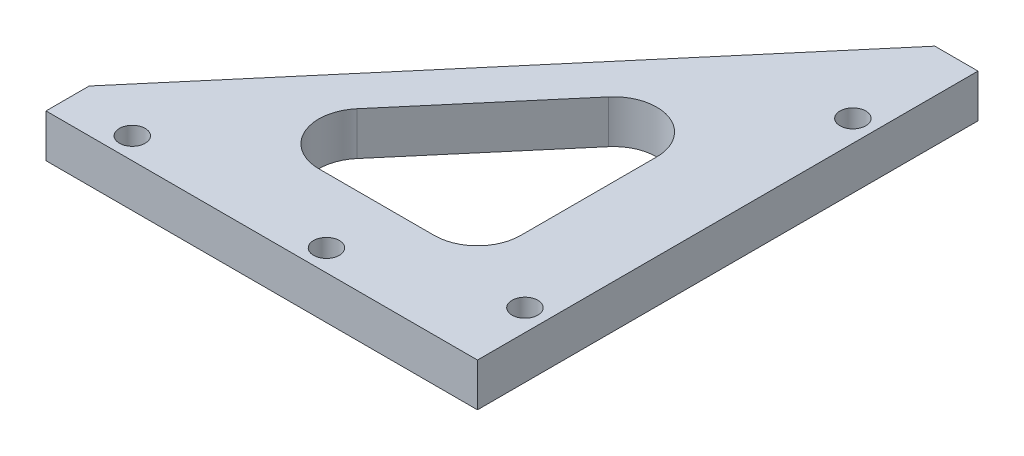
ISO-10303-21;
HEADER;
FILE_DESCRIPTION(('STEP AP214'),'2;1');
FILE_NAME('part.step','',(''),(''),'','','');
FILE_SCHEMA(('AUTOMOTIVE_DESIGN { 1 0 10303 214 1 1 1 1 }'));
ENDSEC;
DATA;
#1=APPLICATION_CONTEXT('core data for automotive mechanical design processes');
#2=APPLICATION_PROTOCOL_DEFINITION('international standard','automotive_design',2000,#1);
#3=PRODUCT_CONTEXT('',#1,'mechanical');
#4=PRODUCT('Part','Part','',(#3));
#5=PRODUCT_RELATED_PRODUCT_CATEGORY('part','',(#4));
#6=PRODUCT_DEFINITION_FORMATION('','',#4);
#7=PRODUCT_DEFINITION_CONTEXT('part definition',#1,'design');
#8=PRODUCT_DEFINITION('design','',#6,#7);
#9=PRODUCT_DEFINITION_SHAPE('','',#8);
#10=(LENGTH_UNIT() NAMED_UNIT(*) SI_UNIT(.MILLI.,.METRE.));
#11=(NAMED_UNIT(*) PLANE_ANGLE_UNIT() SI_UNIT($,.RADIAN.));
#12=(NAMED_UNIT(*) SI_UNIT($,.STERADIAN.) SOLID_ANGLE_UNIT());
#13=UNCERTAINTY_MEASURE_WITH_UNIT(LENGTH_MEASURE(1.E-05),#10,'distance_accuracy_value','');
#14=(GEOMETRIC_REPRESENTATION_CONTEXT(3) GLOBAL_UNCERTAINTY_ASSIGNED_CONTEXT((#13)) GLOBAL_UNIT_ASSIGNED_CONTEXT((#10,
#11,#12)) REPRESENTATION_CONTEXT('',''));
#15=CARTESIAN_POINT('',(0.,0.,0.));
#16=DIRECTION('',(0.,0.,1.));
#17=DIRECTION('',(1.,0.,0.));
#18=AXIS2_PLACEMENT_3D('',#15,#16,#17);
#19=CARTESIAN_POINT('',(0.,6.35,0.));
#20=DIRECTION('',(0.,-1.,0.));
#21=DIRECTION('',(0.,0.,-1.));
#22=AXIS2_PLACEMENT_3D('',#19,#20,#21);
#23=PLANE('',#22);
#24=CARTESIAN_POINT('',(9.525,6.35,-3.175));
#25=DIRECTION('',(0.,1.,0.));
#26=DIRECTION('',(0.,0.,1.));
#27=AXIS2_PLACEMENT_3D('',#24,#25,#26);
#28=CIRCLE('',#27,1.89865);
#29=CARTESIAN_POINT('',(9.525,6.35,-1.27635));
#30=VERTEX_POINT('',#29);
#31=EDGE_CURVE('E263',#30,#30,#28,.T.);
#32=ORIENTED_EDGE('',*,*,#31,.F.);
#33=EDGE_LOOP('',(#32));
#34=FACE_BOUND('',#33,.T.);
#35=CARTESIAN_POINT('',(38.1,6.35,-3.175));
#36=DIRECTION('',(0.,1.,0.));
#37=DIRECTION('',(0.,0.,1.));
#38=AXIS2_PLACEMENT_3D('',#35,#36,#37);
#39=CIRCLE('',#38,1.89864999999999);
#40=CARTESIAN_POINT('',(38.1,6.35,-1.27635));
#41=VERTEX_POINT('',#40);
#42=EDGE_CURVE('E197',#41,#41,#39,.T.);
#43=ORIENTED_EDGE('',*,*,#42,.F.);
#44=EDGE_LOOP('',(#43));
#45=FACE_BOUND('',#44,.T.);
#46=CARTESIAN_POINT('',(60.325,6.35,-10.16));
#47=DIRECTION('',(0.,1.,0.));
#48=DIRECTION('',(0.,0.,1.));
#49=AXIS2_PLACEMENT_3D('',#46,#47,#48);
#50=CIRCLE('',#49,1.89864999999999);
#51=CARTESIAN_POINT('',(60.325,6.35,-8.26135000000001));
#52=VERTEX_POINT('',#51);
#53=EDGE_CURVE('E196',#52,#52,#50,.T.);
#54=ORIENTED_EDGE('',*,*,#53,.F.);
#55=EDGE_LOOP('',(#54));
#56=FACE_BOUND('',#55,.T.);
#57=CARTESIAN_POINT('',(60.325,6.35,-58.42));
#58=DIRECTION('',(0.,1.,0.));
#59=DIRECTION('',(0.,0.,1.));
#60=AXIS2_PLACEMENT_3D('',#57,#58,#59);
#61=CIRCLE('',#60,1.89864999999999);
#62=CARTESIAN_POINT('',(60.325,6.35,-56.52135));
#63=VERTEX_POINT('',#62);
#64=EDGE_CURVE('E247',#63,#63,#61,.T.);
#65=ORIENTED_EDGE('',*,*,#64,.F.);
#66=EDGE_LOOP('',(#65));
#67=FACE_BOUND('',#66,.T.);
#68=DIRECTION('',(0.,0.,-1.));
#69=VECTOR('',#68,1.);
#70=CARTESIAN_POINT('',(0.,6.35,0.));
#71=LINE('',#70,#69);
#72=CARTESIAN_POINT('',(0.,6.35,0.));
#73=VERTEX_POINT('',#72);
#74=CARTESIAN_POINT('',(0.,6.35,-6.35000000000001));
#75=VERTEX_POINT('',#74);
#76=EDGE_CURVE('E157',#73,#75,#71,.T.);
#77=ORIENTED_EDGE('',*,*,#76,.F.);
#78=DIRECTION('',(1.,0.,0.));
#79=VECTOR('',#78,1.);
#80=CARTESIAN_POINT('',(0.,6.35,0.));
#81=LINE('',#80,#79);
#82=CARTESIAN_POINT('',(63.5,6.35,0.));
#83=VERTEX_POINT('',#82);
#84=EDGE_CURVE('E152',#73,#83,#81,.T.);
#85=ORIENTED_EDGE('',*,*,#84,.T.);
#86=DIRECTION('',(0.,0.,-1.));
#87=VECTOR('',#86,1.);
#88=CARTESIAN_POINT('',(63.5,6.35,0.));
#89=LINE('',#88,#87);
#90=CARTESIAN_POINT('',(63.5,6.35,-73.66));
#91=VERTEX_POINT('',#90);
#92=EDGE_CURVE('E173',#83,#91,#89,.T.);
#93=ORIENTED_EDGE('',*,*,#92,.T.);
#94=DIRECTION('',(1.,0.,0.));
#95=VECTOR('',#94,1.);
#96=CARTESIAN_POINT('',(57.15,6.35,-73.66));
#97=LINE('',#96,#95);
#98=CARTESIAN_POINT('',(57.15,6.35,-73.66));
#99=VERTEX_POINT('',#98);
#100=EDGE_CURVE('E159',#99,#91,#97,.T.);
#101=ORIENTED_EDGE('',*,*,#100,.F.);
#102=DIRECTION('',(0.647230821935947,0.,-0.762294079169003));
#103=VECTOR('',#102,1.);
#104=CARTESIAN_POINT('',(0.,6.35,-6.35000000000001));
#105=LINE('',#104,#103);
#106=EDGE_CURVE('E144',#75,#99,#105,.T.);
#107=ORIENTED_EDGE('',*,*,#106,.F.);
#108=EDGE_LOOP('',(#77,#85,#93,#101,#107));
#109=FACE_BOUND('',#108,.T.);
#110=DIRECTION('',(0.,0.,-1.));
#111=VECTOR('',#110,1.);
#112=CARTESIAN_POINT('',(50.8,6.35,0.));
#113=LINE('',#112,#111);
#114=CARTESIAN_POINT('',(50.8,6.35,-19.05));
#115=VERTEX_POINT('',#114);
#116=CARTESIAN_POINT('',(50.8,6.35,-39.08016534611));
#117=VERTEX_POINT('',#116);
#118=EDGE_CURVE('E227',#115,#117,#113,.T.);
#119=ORIENTED_EDGE('',*,*,#118,.F.);
#120=CARTESIAN_POINT('',(44.45,6.35,-19.05));
#121=DIRECTION('',(0.,-1.,0.));
#122=DIRECTION('',(0.,0.,-1.));
#123=AXIS2_PLACEMENT_3D('',#120,#121,#122);
#124=CIRCLE('',#123,6.35);
#125=CARTESIAN_POINT('',(44.45,6.35,-12.7));
#126=VERTEX_POINT('',#125);
#127=EDGE_CURVE('E72',#115,#126,#124,.T.);
#128=ORIENTED_EDGE('',*,*,#127,.T.);
#129=DIRECTION('',(1.,0.,0.));
#130=VECTOR('',#129,1.);
#131=CARTESIAN_POINT('',(0.,6.35,-12.7));
#132=LINE('',#131,#130);
#133=CARTESIAN_POINT('',(27.4432558382085,6.35,-12.7));
#134=VERTEX_POINT('',#133);
#135=EDGE_CURVE('E178',#134,#126,#132,.T.);
#136=ORIENTED_EDGE('',*,*,#135,.F.);
#137=CARTESIAN_POINT('',(27.4432558382085,6.35,-19.05));
#138=DIRECTION('',(0.,-1.,0.));
#139=DIRECTION('',(0.,0.,-1.));
#140=AXIS2_PLACEMENT_3D('',#137,#138,#139);
#141=CIRCLE('',#140,6.35);
#142=CARTESIAN_POINT('',(22.6026884354853,6.35,-23.1599157192933));
#143=VERTEX_POINT('',#142);
#144=EDGE_CURVE('E12',#134,#143,#141,.T.);
#145=ORIENTED_EDGE('',*,*,#144,.T.);
#146=DIRECTION('',(-0.647230821935946,0.,0.762294079169004));
#147=VECTOR('',#146,1.);
#148=CARTESIAN_POINT('',(1.70760298402232,6.35,1.44985159020763));
#149=LINE('',#148,#147);
#150=CARTESIAN_POINT('',(39.6094325972768,6.35,-43.1900810654032));
#151=VERTEX_POINT('',#150);
#152=EDGE_CURVE('E231',#151,#143,#149,.T.);
#153=ORIENTED_EDGE('',*,*,#152,.F.);
#154=CARTESIAN_POINT('',(44.45,6.35,-39.08016534611));
#155=DIRECTION('',(0.,-1.,0.));
#156=DIRECTION('',(0.,0.,-1.));
#157=AXIS2_PLACEMENT_3D('',#154,#155,#156);
#158=CIRCLE('',#157,6.35);
#159=EDGE_CURVE('E213',#151,#117,#158,.T.);
#160=ORIENTED_EDGE('',*,*,#159,.T.);
#161=EDGE_LOOP('',(#119,#128,#136,#145,#153,#160));
#162=FACE_BOUND('',#161,.T.);
#163=ADVANCED_FACE('F57',(#34,#45,#56,#67,#109,#162),#23,.F.);
#164=CARTESIAN_POINT('',(0.,0.,0.));
#165=DIRECTION('',(0.,-1.,0.));
#166=DIRECTION('',(0.,0.,-1.));
#167=AXIS2_PLACEMENT_3D('',#164,#165,#166);
#168=PLANE('',#167);
#169=CARTESIAN_POINT('',(9.525,0.,-3.175));
#170=DIRECTION('',(0.,-1.,0.));
#171=DIRECTION('',(0.,0.,-1.));
#172=AXIS2_PLACEMENT_3D('',#169,#170,#171);
#173=CIRCLE('',#172,1.89865);
#174=CARTESIAN_POINT('',(9.525,0.,-5.07365));
#175=VERTEX_POINT('',#174);
#176=EDGE_CURVE('E260',#175,#175,#173,.T.);
#177=ORIENTED_EDGE('',*,*,#176,.F.);
#178=EDGE_LOOP('',(#177));
#179=FACE_BOUND('',#178,.T.);
#180=CARTESIAN_POINT('',(38.1,0.,-3.175));
#181=DIRECTION('',(0.,-1.,0.));
#182=DIRECTION('',(0.,0.,-1.));
#183=AXIS2_PLACEMENT_3D('',#180,#181,#182);
#184=CIRCLE('',#183,1.89864999999999);
#185=CARTESIAN_POINT('',(38.1,0.,-5.07364999999999));
#186=VERTEX_POINT('',#185);
#187=EDGE_CURVE('E193',#186,#186,#184,.T.);
#188=ORIENTED_EDGE('',*,*,#187,.F.);
#189=EDGE_LOOP('',(#188));
#190=FACE_BOUND('',#189,.T.);
#191=CARTESIAN_POINT('',(60.325,0.,-10.16));
#192=DIRECTION('',(0.,-1.,0.));
#193=DIRECTION('',(0.,0.,-1.));
#194=AXIS2_PLACEMENT_3D('',#191,#192,#193);
#195=CIRCLE('',#194,1.89864999999999);
#196=CARTESIAN_POINT('',(60.325,0.,-12.05865));
#197=VERTEX_POINT('',#196);
#198=EDGE_CURVE('E251',#197,#197,#195,.T.);
#199=ORIENTED_EDGE('',*,*,#198,.F.);
#200=EDGE_LOOP('',(#199));
#201=FACE_BOUND('',#200,.T.);
#202=CARTESIAN_POINT('',(60.325,0.,-58.42));
#203=DIRECTION('',(0.,-1.,0.));
#204=DIRECTION('',(0.,0.,-1.));
#205=AXIS2_PLACEMENT_3D('',#202,#203,#204);
#206=CIRCLE('',#205,1.89864999999999);
#207=CARTESIAN_POINT('',(60.325,0.,-60.31865));
#208=VERTEX_POINT('',#207);
#209=EDGE_CURVE('E244',#208,#208,#206,.T.);
#210=ORIENTED_EDGE('',*,*,#209,.F.);
#211=EDGE_LOOP('',(#210));
#212=FACE_BOUND('',#211,.T.);
#213=DIRECTION('',(0.,0.,-1.));
#214=VECTOR('',#213,1.);
#215=CARTESIAN_POINT('',(0.,0.,0.));
#216=LINE('',#215,#214);
#217=CARTESIAN_POINT('',(0.,0.,0.));
#218=VERTEX_POINT('',#217);
#219=CARTESIAN_POINT('',(0.,0.,-6.35000000000001));
#220=VERTEX_POINT('',#219);
#221=EDGE_CURVE('E176',#218,#220,#216,.T.);
#222=ORIENTED_EDGE('',*,*,#221,.T.);
#223=DIRECTION('',(0.647230821935947,0.,-0.762294079169003));
#224=VECTOR('',#223,1.);
#225=CARTESIAN_POINT('',(0.,0.,-6.35000000000001));
#226=LINE('',#225,#224);
#227=CARTESIAN_POINT('',(57.15,0.,-73.66));
#228=VERTEX_POINT('',#227);
#229=EDGE_CURVE('E146',#220,#228,#226,.T.);
#230=ORIENTED_EDGE('',*,*,#229,.T.);
#231=DIRECTION('',(1.,0.,0.));
#232=VECTOR('',#231,1.);
#233=CARTESIAN_POINT('',(57.15,0.,-73.66));
#234=LINE('',#233,#232);
#235=CARTESIAN_POINT('',(63.5,0.,-73.66));
#236=VERTEX_POINT('',#235);
#237=EDGE_CURVE('E180',#228,#236,#234,.T.);
#238=ORIENTED_EDGE('',*,*,#237,.T.);
#239=DIRECTION('',(0.,0.,-1.));
#240=VECTOR('',#239,1.);
#241=CARTESIAN_POINT('',(63.5,0.,0.));
#242=LINE('',#241,#240);
#243=CARTESIAN_POINT('',(63.5,0.,0.));
#244=VERTEX_POINT('',#243);
#245=EDGE_CURVE('E166',#244,#236,#242,.T.);
#246=ORIENTED_EDGE('',*,*,#245,.F.);
#247=DIRECTION('',(1.,0.,0.));
#248=VECTOR('',#247,1.);
#249=CARTESIAN_POINT('',(0.,0.,0.));
#250=LINE('',#249,#248);
#251=EDGE_CURVE('E164',#218,#244,#250,.T.);
#252=ORIENTED_EDGE('',*,*,#251,.F.);
#253=EDGE_LOOP('',(#222,#230,#238,#246,#252));
#254=FACE_BOUND('',#253,.T.);
#255=DIRECTION('',(-0.647230821935946,0.,0.762294079169004));
#256=VECTOR('',#255,1.);
#257=CARTESIAN_POINT('',(1.70760298402232,0.,1.44985159020763));
#258=LINE('',#257,#256);
#259=CARTESIAN_POINT('',(39.6094325972768,0.,-43.1900810654032));
#260=VERTEX_POINT('',#259);
#261=CARTESIAN_POINT('',(22.6026884354853,0.,-23.1599157192933));
#262=VERTEX_POINT('',#261);
#263=EDGE_CURVE('E222',#260,#262,#258,.T.);
#264=ORIENTED_EDGE('',*,*,#263,.T.);
#265=CARTESIAN_POINT('',(27.4432558382085,0.,-19.05));
#266=DIRECTION('',(0.,-1.,0.));
#267=DIRECTION('',(0.,0.,-1.));
#268=AXIS2_PLACEMENT_3D('',#265,#266,#267);
#269=CIRCLE('',#268,6.35);
#270=CARTESIAN_POINT('',(27.4432558382085,0.,-12.7));
#271=VERTEX_POINT('',#270);
#272=EDGE_CURVE('E65',#262,#271,#269,.F.);
#273=ORIENTED_EDGE('',*,*,#272,.T.);
#274=DIRECTION('',(1.,0.,0.));
#275=VECTOR('',#274,1.);
#276=CARTESIAN_POINT('',(0.,0.,-12.7));
#277=LINE('',#276,#275);
#278=CARTESIAN_POINT('',(44.45,0.,-12.7));
#279=VERTEX_POINT('',#278);
#280=EDGE_CURVE('E169',#271,#279,#277,.T.);
#281=ORIENTED_EDGE('',*,*,#280,.T.);
#282=CARTESIAN_POINT('',(44.45,0.,-19.05));
#283=DIRECTION('',(0.,-1.,0.));
#284=DIRECTION('',(0.,0.,-1.));
#285=AXIS2_PLACEMENT_3D('',#282,#283,#284);
#286=CIRCLE('',#285,6.35);
#287=CARTESIAN_POINT('',(50.8,0.,-19.05));
#288=VERTEX_POINT('',#287);
#289=EDGE_CURVE('E215',#279,#288,#286,.F.);
#290=ORIENTED_EDGE('',*,*,#289,.T.);
#291=DIRECTION('',(0.,0.,-1.));
#292=VECTOR('',#291,1.);
#293=CARTESIAN_POINT('',(50.8,0.,0.));
#294=LINE('',#293,#292);
#295=CARTESIAN_POINT('',(50.8,0.,-39.08016534611));
#296=VERTEX_POINT('',#295);
#297=EDGE_CURVE('E242',#288,#296,#294,.T.);
#298=ORIENTED_EDGE('',*,*,#297,.T.);
#299=CARTESIAN_POINT('',(44.45,0.,-39.08016534611));
#300=DIRECTION('',(0.,-1.,0.));
#301=DIRECTION('',(0.,0.,-1.));
#302=AXIS2_PLACEMENT_3D('',#299,#300,#301);
#303=CIRCLE('',#302,6.35);
#304=EDGE_CURVE('E211',#296,#260,#303,.F.);
#305=ORIENTED_EDGE('',*,*,#304,.T.);
#306=EDGE_LOOP('',(#264,#273,#281,#290,#298,#305));
#307=FACE_BOUND('',#306,.T.);
#308=ADVANCED_FACE('F220',(#179,#190,#201,#212,#254,#307),#168,.T.);
#309=CARTESIAN_POINT('',(0.,6.35,0.));
#310=DIRECTION('',(-1.,0.,0.));
#311=DIRECTION('',(0.,0.,1.));
#312=AXIS2_PLACEMENT_3D('',#309,#310,#311);
#313=PLANE('',#312);
#314=ORIENTED_EDGE('',*,*,#221,.F.);
#315=DIRECTION('',(0.,-1.,0.));
#316=VECTOR('',#315,1.);
#317=CARTESIAN_POINT('',(0.,6.35,0.));
#318=LINE('',#317,#316);
#319=EDGE_CURVE('E162',#73,#218,#318,.T.);
#320=ORIENTED_EDGE('',*,*,#319,.F.);
#321=ORIENTED_EDGE('',*,*,#76,.T.);
#322=DIRECTION('',(0.,-1.,0.));
#323=VECTOR('',#322,1.);
#324=CARTESIAN_POINT('',(0.,6.35,-6.35000000000001));
#325=LINE('',#324,#323);
#326=EDGE_CURVE('E141',#75,#220,#325,.T.);
#327=ORIENTED_EDGE('',*,*,#326,.T.);
#328=EDGE_LOOP('',(#314,#320,#321,#327));
#329=FACE_BOUND('',#328,.T.);
#330=ADVANCED_FACE('F161',(#329),#313,.T.);
#331=CARTESIAN_POINT('',(0.,6.35,0.));
#332=DIRECTION('',(0.,0.,-1.));
#333=DIRECTION('',(-1.,0.,0.));
#334=AXIS2_PLACEMENT_3D('',#331,#332,#333);
#335=PLANE('',#334);
#336=ORIENTED_EDGE('',*,*,#251,.T.);
#337=DIRECTION('',(0.,-1.,0.));
#338=VECTOR('',#337,1.);
#339=CARTESIAN_POINT('',(63.5,6.35,0.));
#340=LINE('',#339,#338);
#341=EDGE_CURVE('E187',#83,#244,#340,.T.);
#342=ORIENTED_EDGE('',*,*,#341,.F.);
#343=ORIENTED_EDGE('',*,*,#84,.F.);
#344=ORIENTED_EDGE('',*,*,#319,.T.);
#345=EDGE_LOOP('',(#336,#342,#343,#344));
#346=FACE_BOUND('',#345,.T.);
#347=ADVANCED_FACE('F301',(#346),#335,.F.);
#348=CARTESIAN_POINT('',(63.5,6.35,0.));
#349=DIRECTION('',(-1.,0.,0.));
#350=DIRECTION('',(0.,0.,1.));
#351=AXIS2_PLACEMENT_3D('',#348,#349,#350);
#352=PLANE('',#351);
#353=ORIENTED_EDGE('',*,*,#245,.T.);
#354=DIRECTION('',(0.,-1.,0.));
#355=VECTOR('',#354,1.);
#356=CARTESIAN_POINT('',(63.5,6.35,-73.66));
#357=LINE('',#356,#355);
#358=EDGE_CURVE('E190',#91,#236,#357,.T.);
#359=ORIENTED_EDGE('',*,*,#358,.F.);
#360=ORIENTED_EDGE('',*,*,#92,.F.);
#361=ORIENTED_EDGE('',*,*,#341,.T.);
#362=EDGE_LOOP('',(#353,#359,#360,#361));
#363=FACE_BOUND('',#362,.T.);
#364=ADVANCED_FACE('F304',(#363),#352,.F.);
#365=CARTESIAN_POINT('',(57.15,6.35,-73.66));
#366=DIRECTION('',(0.,0.,-1.));
#367=DIRECTION('',(-1.,0.,0.));
#368=AXIS2_PLACEMENT_3D('',#365,#366,#367);
#369=PLANE('',#368);
#370=ORIENTED_EDGE('',*,*,#237,.F.);
#371=DIRECTION('',(0.,-1.,0.));
#372=VECTOR('',#371,1.);
#373=CARTESIAN_POINT('',(57.15,6.35,-73.66));
#374=LINE('',#373,#372);
#375=EDGE_CURVE('E151',#99,#228,#374,.T.);
#376=ORIENTED_EDGE('',*,*,#375,.F.);
#377=ORIENTED_EDGE('',*,*,#100,.T.);
#378=ORIENTED_EDGE('',*,*,#358,.T.);
#379=EDGE_LOOP('',(#370,#376,#377,#378));
#380=FACE_BOUND('',#379,.T.);
#381=ADVANCED_FACE('F308',(#380),#369,.T.);
#382=CARTESIAN_POINT('',(0.,6.35,-6.35000000000001));
#383=DIRECTION('',(-0.762294079169003,0.,-0.647230821935947));
#384=DIRECTION('',(-0.647230821935947,0.,0.762294079169003));
#385=AXIS2_PLACEMENT_3D('',#382,#383,#384);
#386=PLANE('',#385);
#387=ORIENTED_EDGE('',*,*,#229,.F.);
#388=ORIENTED_EDGE('',*,*,#326,.F.);
#389=ORIENTED_EDGE('',*,*,#106,.T.);
#390=ORIENTED_EDGE('',*,*,#375,.T.);
#391=EDGE_LOOP('',(#387,#388,#389,#390));
#392=FACE_BOUND('',#391,.T.);
#393=ADVANCED_FACE('F143',(#392),#386,.T.);
#394=CARTESIAN_POINT('',(50.8,6.35,0.));
#395=DIRECTION('',(-1.,0.,0.));
#396=DIRECTION('',(0.,0.,1.));
#397=AXIS2_PLACEMENT_3D('',#394,#395,#396);
#398=PLANE('',#397);
#399=ORIENTED_EDGE('',*,*,#118,.T.);
#400=DIRECTION('',(0.,-1.,0.));
#401=VECTOR('',#400,1.);
#402=CARTESIAN_POINT('',(50.8,0.,-39.08016534611));
#403=LINE('',#402,#401);
#404=EDGE_CURVE('E199',#117,#296,#403,.T.);
#405=ORIENTED_EDGE('',*,*,#404,.T.);
#406=ORIENTED_EDGE('',*,*,#297,.F.);
#407=DIRECTION('',(0.,-1.,0.));
#408=VECTOR('',#407,1.);
#409=CARTESIAN_POINT('',(50.8,6.35,-19.05));
#410=LINE('',#409,#408);
#411=EDGE_CURVE('E186',#288,#115,#410,.F.);
#412=ORIENTED_EDGE('',*,*,#411,.T.);
#413=EDGE_LOOP('',(#399,#405,#406,#412));
#414=FACE_BOUND('',#413,.T.);
#415=ADVANCED_FACE('F294',(#414),#398,.T.);
#416=CARTESIAN_POINT('',(1.70760298402232,6.35,1.44985159020763));
#417=DIRECTION('',(0.762294079169004,0.,0.647230821935946));
#418=DIRECTION('',(0.647230821935946,0.,-0.762294079169004));
#419=AXIS2_PLACEMENT_3D('',#416,#417,#418);
#420=PLANE('',#419);
#421=ORIENTED_EDGE('',*,*,#263,.F.);
#422=DIRECTION('',(0.,-1.,0.));
#423=VECTOR('',#422,1.);
#424=CARTESIAN_POINT('',(39.6094325972768,6.35,-43.1900810654032));
#425=LINE('',#424,#423);
#426=EDGE_CURVE('E205',#260,#151,#425,.F.);
#427=ORIENTED_EDGE('',*,*,#426,.T.);
#428=ORIENTED_EDGE('',*,*,#152,.T.);
#429=DIRECTION('',(0.,-1.,0.));
#430=VECTOR('',#429,1.);
#431=CARTESIAN_POINT('',(22.6026884354853,0.,-23.1599157192933));
#432=LINE('',#431,#430);
#433=EDGE_CURVE('E202',#143,#262,#432,.T.);
#434=ORIENTED_EDGE('',*,*,#433,.T.);
#435=EDGE_LOOP('',(#421,#427,#428,#434));
#436=FACE_BOUND('',#435,.T.);
#437=ADVANCED_FACE('F234',(#436),#420,.T.);
#438=CARTESIAN_POINT('',(0.,6.35,-12.7));
#439=DIRECTION('',(0.,0.,-1.));
#440=DIRECTION('',(-1.,0.,0.));
#441=AXIS2_PLACEMENT_3D('',#438,#439,#440);
#442=PLANE('',#441);
#443=ORIENTED_EDGE('',*,*,#135,.T.);
#444=DIRECTION('',(0.,-1.,0.));
#445=VECTOR('',#444,1.);
#446=CARTESIAN_POINT('',(44.45,0.,-12.7));
#447=LINE('',#446,#445);
#448=EDGE_CURVE('E208',#126,#279,#447,.T.);
#449=ORIENTED_EDGE('',*,*,#448,.T.);
#450=ORIENTED_EDGE('',*,*,#280,.F.);
#451=DIRECTION('',(0.,-1.,0.));
#452=VECTOR('',#451,1.);
#453=CARTESIAN_POINT('',(27.4432558382085,6.35,-12.7));
#454=LINE('',#453,#452);
#455=EDGE_CURVE('E79',#271,#134,#454,.F.);
#456=ORIENTED_EDGE('',*,*,#455,.T.);
#457=EDGE_LOOP('',(#443,#449,#450,#456));
#458=FACE_BOUND('',#457,.T.);
#459=ADVANCED_FACE('F225',(#458),#442,.T.);
#460=CARTESIAN_POINT('',(60.325,6.35,-58.42));
#461=DIRECTION('',(0.,1.,0.));
#462=DIRECTION('',(0.,0.,1.));
#463=AXIS2_PLACEMENT_3D('',#460,#461,#462);
#464=CYLINDRICAL_SURFACE('',#463,1.89864999999999);
#465=ORIENTED_EDGE('',*,*,#209,.T.);
#466=EDGE_LOOP('',(#465));
#467=FACE_BOUND('',#466,.T.);
#468=ORIENTED_EDGE('',*,*,#64,.T.);
#469=EDGE_LOOP('',(#468));
#470=FACE_BOUND('',#469,.T.);
#471=ADVANCED_FACE('F278',(#467,#470),#464,.F.);
#472=CARTESIAN_POINT('',(60.325,6.35,-10.16));
#473=DIRECTION('',(0.,1.,0.));
#474=DIRECTION('',(0.,0.,1.));
#475=AXIS2_PLACEMENT_3D('',#472,#473,#474);
#476=CYLINDRICAL_SURFACE('',#475,1.89864999999999);
#477=ORIENTED_EDGE('',*,*,#198,.T.);
#478=EDGE_LOOP('',(#477));
#479=FACE_BOUND('',#478,.T.);
#480=ORIENTED_EDGE('',*,*,#53,.T.);
#481=EDGE_LOOP('',(#480));
#482=FACE_BOUND('',#481,.T.);
#483=ADVANCED_FACE('F280',(#479,#482),#476,.F.);
#484=CARTESIAN_POINT('',(38.1,6.35,-3.175));
#485=DIRECTION('',(0.,1.,0.));
#486=DIRECTION('',(0.,0.,1.));
#487=AXIS2_PLACEMENT_3D('',#484,#485,#486);
#488=CYLINDRICAL_SURFACE('',#487,1.89864999999999);
#489=ORIENTED_EDGE('',*,*,#187,.T.);
#490=EDGE_LOOP('',(#489));
#491=FACE_BOUND('',#490,.T.);
#492=ORIENTED_EDGE('',*,*,#42,.T.);
#493=EDGE_LOOP('',(#492));
#494=FACE_BOUND('',#493,.T.);
#495=ADVANCED_FACE('F286',(#491,#494),#488,.F.);
#496=CARTESIAN_POINT('',(9.525,6.35,-3.175));
#497=DIRECTION('',(0.,1.,0.));
#498=DIRECTION('',(0.,0.,1.));
#499=AXIS2_PLACEMENT_3D('',#496,#497,#498);
#500=CYLINDRICAL_SURFACE('',#499,1.89865);
#501=ORIENTED_EDGE('',*,*,#176,.T.);
#502=EDGE_LOOP('',(#501));
#503=FACE_BOUND('',#502,.T.);
#504=ORIENTED_EDGE('',*,*,#31,.T.);
#505=EDGE_LOOP('',(#504));
#506=FACE_BOUND('',#505,.T.);
#507=ADVANCED_FACE('F267',(#503,#506),#500,.F.);
#508=CARTESIAN_POINT('',(44.45,6.35,-39.08016534611));
#509=DIRECTION('',(0.,1.,0.));
#510=DIRECTION('',(0.,0.,1.));
#511=AXIS2_PLACEMENT_3D('',#508,#509,#510);
#512=CYLINDRICAL_SURFACE('',#511,6.35);
#513=ORIENTED_EDGE('',*,*,#159,.F.);
#514=ORIENTED_EDGE('',*,*,#426,.F.);
#515=ORIENTED_EDGE('',*,*,#304,.F.);
#516=ORIENTED_EDGE('',*,*,#404,.F.);
#517=EDGE_LOOP('',(#513,#514,#515,#516));
#518=FACE_BOUND('',#517,.T.);
#519=ADVANCED_FACE('F317',(#518),#512,.F.);
#520=CARTESIAN_POINT('',(44.45,6.35,-19.05));
#521=DIRECTION('',(0.,1.,0.));
#522=DIRECTION('',(0.,0.,1.));
#523=AXIS2_PLACEMENT_3D('',#520,#521,#522);
#524=CYLINDRICAL_SURFACE('',#523,6.35);
#525=ORIENTED_EDGE('',*,*,#127,.F.);
#526=ORIENTED_EDGE('',*,*,#411,.F.);
#527=ORIENTED_EDGE('',*,*,#289,.F.);
#528=ORIENTED_EDGE('',*,*,#448,.F.);
#529=EDGE_LOOP('',(#525,#526,#527,#528));
#530=FACE_BOUND('',#529,.T.);
#531=ADVANCED_FACE('F319',(#530),#524,.F.);
#532=CARTESIAN_POINT('',(27.4432558382085,6.35,-19.05));
#533=DIRECTION('',(0.,1.,0.));
#534=DIRECTION('',(0.,0.,1.));
#535=AXIS2_PLACEMENT_3D('',#532,#533,#534);
#536=CYLINDRICAL_SURFACE('',#535,6.35);
#537=ORIENTED_EDGE('',*,*,#144,.F.);
#538=ORIENTED_EDGE('',*,*,#455,.F.);
#539=ORIENTED_EDGE('',*,*,#272,.F.);
#540=ORIENTED_EDGE('',*,*,#433,.F.);
#541=EDGE_LOOP('',(#537,#538,#539,#540));
#542=FACE_BOUND('',#541,.T.);
#543=ADVANCED_FACE('F59',(#542),#536,.F.);
#544=CLOSED_SHELL('',(#163,#308,#330,#347,#364,#381,#393,#415,#437,#459,#471,#483,#495,#507,
#519,#531,#543));
#545=MANIFOLD_SOLID_BREP('B2',#544);
#546=ADVANCED_BREP_SHAPE_REPRESENTATION('',(#18,#545),#14);
#547=SHAPE_DEFINITION_REPRESENTATION(#9,#546);
ENDSEC;
END-ISO-10303-21;
